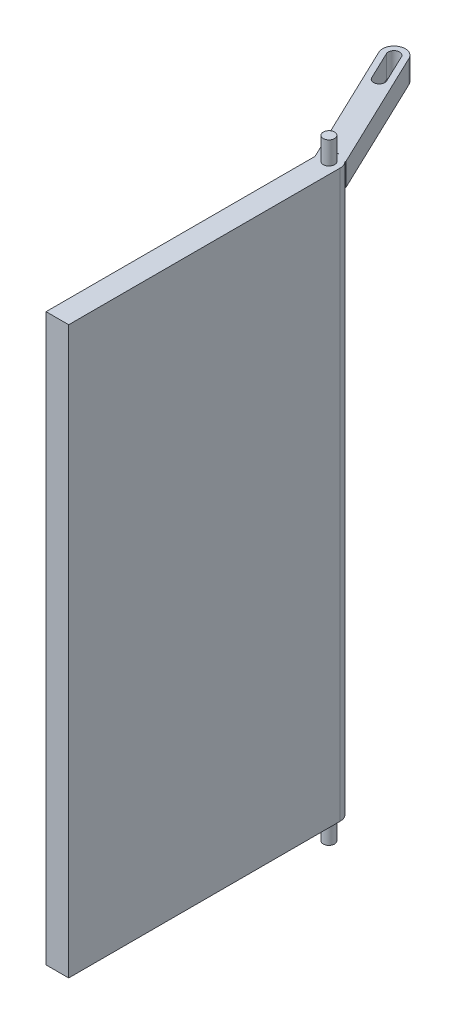
ISO-10303-21;
HEADER;
FILE_DESCRIPTION(('STEP AP214'),'2;1');
FILE_NAME('part.step','',(''),(''),'','','');
FILE_SCHEMA(('AUTOMOTIVE_DESIGN { 1 0 10303 214 1 1 1 1 }'));
ENDSEC;
DATA;
#1=APPLICATION_CONTEXT('core data for automotive mechanical design processes');
#2=APPLICATION_PROTOCOL_DEFINITION('international standard','automotive_design',2000,#1);
#3=PRODUCT_CONTEXT('',#1,'mechanical');
#4=PRODUCT('Part','Part','',(#3));
#5=PRODUCT_RELATED_PRODUCT_CATEGORY('part','',(#4));
#6=PRODUCT_DEFINITION_FORMATION('','',#4);
#7=PRODUCT_DEFINITION_CONTEXT('part definition',#1,'design');
#8=PRODUCT_DEFINITION('design','',#6,#7);
#9=PRODUCT_DEFINITION_SHAPE('','',#8);
#10=(LENGTH_UNIT() NAMED_UNIT(*) SI_UNIT(.MILLI.,.METRE.));
#11=(NAMED_UNIT(*) PLANE_ANGLE_UNIT() SI_UNIT($,.RADIAN.));
#12=(NAMED_UNIT(*) SI_UNIT($,.STERADIAN.) SOLID_ANGLE_UNIT());
#13=UNCERTAINTY_MEASURE_WITH_UNIT(LENGTH_MEASURE(1.E-05),#10,'distance_accuracy_value','');
#14=(GEOMETRIC_REPRESENTATION_CONTEXT(3) GLOBAL_UNCERTAINTY_ASSIGNED_CONTEXT((#13)) GLOBAL_UNIT_ASSIGNED_CONTEXT((#10,
#11,#12)) REPRESENTATION_CONTEXT('',''));
#15=CARTESIAN_POINT('',(0.,0.,0.));
#16=DIRECTION('',(0.,0.,1.));
#17=DIRECTION('',(1.,0.,0.));
#18=AXIS2_PLACEMENT_3D('',#15,#16,#17);
#19=CARTESIAN_POINT('',(190.,-423.051186344326,0.));
#20=DIRECTION('',(-1.,0.,0.));
#21=DIRECTION('',(0.,0.,1.));
#22=AXIS2_PLACEMENT_3D('',#19,#20,#21);
#23=PLANE('',#22);
#24=DIRECTION('',(0.,0.,1.));
#25=VECTOR('',#24,1.);
#26=CARTESIAN_POINT('',(190.,-122.731696712451,0.));
#27=LINE('',#26,#25);
#28=CARTESIAN_POINT('',(190.,-122.731696712451,59.9062300544291));
#29=VERTEX_POINT('',#28);
#30=CARTESIAN_POINT('',(190.,-122.731696712451,155.));
#31=VERTEX_POINT('',#30);
#32=EDGE_CURVE('E261',#29,#31,#27,.T.);
#33=ORIENTED_EDGE('',*,*,#32,.F.);
#34=DIRECTION('',(0.,1.,0.));
#35=VECTOR('',#34,1.);
#36=CARTESIAN_POINT('',(190.,-130.731696712451,59.9062300544291));
#37=LINE('',#36,#35);
#38=CARTESIAN_POINT('',(190.,-130.731696712451,59.9062300544291));
#39=VERTEX_POINT('',#38);
#40=EDGE_CURVE('E242',#39,#29,#37,.T.);
#41=ORIENTED_EDGE('',*,*,#40,.F.);
#42=DIRECTION('',(0.,0.,1.));
#43=VECTOR('',#42,1.);
#44=CARTESIAN_POINT('',(190.,-130.731696712451,0.));
#45=LINE('',#44,#43);
#46=CARTESIAN_POINT('',(190.,-130.731696712451,59.));
#47=VERTEX_POINT('',#46);
#48=EDGE_CURVE('E208',#47,#39,#45,.T.);
#49=ORIENTED_EDGE('',*,*,#48,.F.);
#50=DIRECTION('',(0.,1.,0.));
#51=VECTOR('',#50,1.);
#52=CARTESIAN_POINT('',(190.,-423.051186344326,59.));
#53=LINE('',#52,#51);
#54=CARTESIAN_POINT('',(190.,-322.731696712451,59.));
#55=VERTEX_POINT('',#54);
#56=EDGE_CURVE('E271',#55,#47,#53,.T.);
#57=ORIENTED_EDGE('',*,*,#56,.F.);
#58=DIRECTION('',(0.,0.,-1.));
#59=VECTOR('',#58,1.);
#60=CARTESIAN_POINT('',(190.,-322.731696712451,0.));
#61=LINE('',#60,#59);
#62=CARTESIAN_POINT('',(190.,-322.731696712451,155.));
#63=VERTEX_POINT('',#62);
#64=EDGE_CURVE('E249',#63,#55,#61,.T.);
#65=ORIENTED_EDGE('',*,*,#64,.F.);
#66=DIRECTION('',(0.,1.,0.));
#67=VECTOR('',#66,1.);
#68=CARTESIAN_POINT('',(190.,-423.051186344326,155.));
#69=LINE('',#68,#67);
#70=EDGE_CURVE('E268',#63,#31,#69,.T.);
#71=ORIENTED_EDGE('',*,*,#70,.T.);
#72=EDGE_LOOP('',(#33,#41,#49,#57,#65,#71));
#73=FACE_BOUND('',#72,.T.);
#74=ADVANCED_FACE('F35',(#73),#23,.T.);
#75=CARTESIAN_POINT('',(198.,-423.051186344326,0.));
#76=DIRECTION('',(1.,0.,0.));
#77=DIRECTION('',(0.,0.,-1.));
#78=AXIS2_PLACEMENT_3D('',#75,#76,#77);
#79=PLANE('',#78);
#80=DIRECTION('',(0.,0.,1.));
#81=VECTOR('',#80,1.);
#82=CARTESIAN_POINT('',(198.,-322.731696712451,0.));
#83=LINE('',#82,#81);
#84=CARTESIAN_POINT('',(198.,-322.731696712451,59.));
#85=VERTEX_POINT('',#84);
#86=CARTESIAN_POINT('',(198.,-322.731696712451,155.));
#87=VERTEX_POINT('',#86);
#88=EDGE_CURVE('E43',#85,#87,#83,.T.);
#89=ORIENTED_EDGE('',*,*,#88,.F.);
#90=DIRECTION('',(0.,1.,0.));
#91=VECTOR('',#90,1.);
#92=CARTESIAN_POINT('',(198.,-423.051186344326,59.));
#93=LINE('',#92,#91);
#94=CARTESIAN_POINT('',(198.,-122.731696712451,59.));
#95=VERTEX_POINT('',#94);
#96=EDGE_CURVE('E266',#85,#95,#93,.T.);
#97=ORIENTED_EDGE('',*,*,#96,.T.);
#98=DIRECTION('',(0.,0.,-1.));
#99=VECTOR('',#98,1.);
#100=CARTESIAN_POINT('',(198.,-122.731696712451,0.));
#101=LINE('',#100,#99);
#102=CARTESIAN_POINT('',(198.,-122.731696712451,155.));
#103=VERTEX_POINT('',#102);
#104=EDGE_CURVE('E233',#103,#95,#101,.T.);
#105=ORIENTED_EDGE('',*,*,#104,.F.);
#106=DIRECTION('',(0.,1.,0.));
#107=VECTOR('',#106,1.);
#108=CARTESIAN_POINT('',(198.,-423.051186344326,155.));
#109=LINE('',#108,#107);
#110=EDGE_CURVE('E252',#87,#103,#109,.T.);
#111=ORIENTED_EDGE('',*,*,#110,.F.);
#112=EDGE_LOOP('',(#89,#97,#105,#111));
#113=FACE_BOUND('',#112,.T.);
#114=ADVANCED_FACE('F37',(#113),#79,.T.);
#115=CARTESIAN_POINT('',(190.,-423.051186344326,155.));
#116=DIRECTION('',(0.,0.,1.));
#117=DIRECTION('',(1.,0.,0.));
#118=AXIS2_PLACEMENT_3D('',#115,#116,#117);
#119=PLANE('',#118);
#120=DIRECTION('',(-1.,0.,0.));
#121=VECTOR('',#120,1.);
#122=CARTESIAN_POINT('',(190.,-322.731696712451,155.));
#123=LINE('',#122,#121);
#124=EDGE_CURVE('E251',#87,#63,#123,.T.);
#125=ORIENTED_EDGE('',*,*,#124,.F.);
#126=ORIENTED_EDGE('',*,*,#110,.T.);
#127=DIRECTION('',(1.,0.,0.));
#128=VECTOR('',#127,1.);
#129=CARTESIAN_POINT('',(190.,-122.731696712451,155.));
#130=LINE('',#129,#128);
#131=EDGE_CURVE('E263',#31,#103,#130,.T.);
#132=ORIENTED_EDGE('',*,*,#131,.F.);
#133=ORIENTED_EDGE('',*,*,#70,.F.);
#134=EDGE_LOOP('',(#125,#126,#132,#133));
#135=FACE_BOUND('',#134,.T.);
#136=ADVANCED_FACE('F290',(#135),#119,.T.);
#137=CARTESIAN_POINT('',(194.,-423.051186344326,59.));
#138=DIRECTION('',(0.,1.,0.));
#139=DIRECTION('',(0.,0.,1.));
#140=AXIS2_PLACEMENT_3D('',#137,#138,#139);
#141=CYLINDRICAL_SURFACE('',#140,4.00000000000002);
#142=DIRECTION('',(0.,1.,0.));
#143=VECTOR('',#142,1.);
#144=CARTESIAN_POINT('',(191.171572875254,-130.731696712451,56.1715728752538));
#145=LINE('',#144,#143);
#146=CARTESIAN_POINT('',(191.171572875254,-130.731696712451,56.1715728752538));
#147=VERTEX_POINT('',#146);
#148=CARTESIAN_POINT('',(191.171572875254,-122.731696712451,56.1715728752538));
#149=VERTEX_POINT('',#148);
#150=EDGE_CURVE('E239',#147,#149,#145,.T.);
#151=ORIENTED_EDGE('',*,*,#150,.T.);
#152=CARTESIAN_POINT('',(194.,-122.731696712451,59.));
#153=DIRECTION('',(0.,1.,0.));
#154=DIRECTION('',(0.,0.,1.));
#155=AXIS2_PLACEMENT_3D('',#152,#153,#154);
#156=CIRCLE('',#155,4.00000000000002);
#157=CARTESIAN_POINT('',(194.,-122.731696712451,55.));
#158=VERTEX_POINT('',#157);
#159=EDGE_CURVE('E257',#158,#149,#156,.T.);
#160=ORIENTED_EDGE('',*,*,#159,.F.);
#161=DIRECTION('',(0.,1.,0.));
#162=VECTOR('',#161,1.);
#163=CARTESIAN_POINT('',(194.,-130.731696712451,55.));
#164=LINE('',#163,#162);
#165=CARTESIAN_POINT('',(194.,-130.731696712451,55.));
#166=VERTEX_POINT('',#165);
#167=EDGE_CURVE('E234',#166,#158,#164,.T.);
#168=ORIENTED_EDGE('',*,*,#167,.F.);
#169=CARTESIAN_POINT('',(194.,-130.731696712451,59.));
#170=DIRECTION('',(0.,1.,0.));
#171=DIRECTION('',(0.,0.,1.));
#172=AXIS2_PLACEMENT_3D('',#169,#170,#171);
#173=CIRCLE('',#172,4.00000000000002);
#174=CARTESIAN_POINT('',(196.828427124746,-130.731696712451,56.1715728752538));
#175=VERTEX_POINT('',#174);
#176=EDGE_CURVE('E216',#175,#166,#173,.T.);
#177=ORIENTED_EDGE('',*,*,#176,.F.);
#178=DIRECTION('',(0.,1.,0.));
#179=VECTOR('',#178,1.);
#180=CARTESIAN_POINT('',(196.828427124746,-130.731696712451,56.1715728752538));
#181=LINE('',#180,#179);
#182=CARTESIAN_POINT('',(196.828427124746,-122.731696712451,56.1715728752538));
#183=VERTEX_POINT('',#182);
#184=EDGE_CURVE('E230',#175,#183,#181,.T.);
#185=ORIENTED_EDGE('',*,*,#184,.T.);
#186=EDGE_CURVE('E258',#95,#183,#156,.T.);
#187=ORIENTED_EDGE('',*,*,#186,.F.);
#188=ORIENTED_EDGE('',*,*,#96,.F.);
#189=CARTESIAN_POINT('',(194.,-322.731696712451,59.));
#190=DIRECTION('',(0.,1.,0.));
#191=DIRECTION('',(0.,0.,1.));
#192=AXIS2_PLACEMENT_3D('',#189,#190,#191);
#193=CIRCLE('',#192,4.00000000000002);
#194=EDGE_CURVE('E11',#55,#85,#193,.F.);
#195=ORIENTED_EDGE('',*,*,#194,.F.);
#196=ORIENTED_EDGE('',*,*,#56,.T.);
#197=CARTESIAN_POINT('',(194.,-130.731696712451,59.));
#198=DIRECTION('',(0.,1.,0.));
#199=DIRECTION('',(0.,0.,1.));
#200=AXIS2_PLACEMENT_3D('',#197,#198,#199);
#201=CIRCLE('',#200,4.00000000000002);
#202=EDGE_CURVE('E210',#147,#47,#201,.T.);
#203=ORIENTED_EDGE('',*,*,#202,.F.);
#204=EDGE_LOOP('',(#151,#160,#168,#177,#185,#187,#188,#195,#196,#203));
#205=FACE_BOUND('',#204,.T.);
#206=ADVANCED_FACE('F281',(#205),#141,.T.);
#207=CARTESIAN_POINT('',(194.,-122.731696712451,59.));
#208=DIRECTION('',(0.,1.,0.));
#209=DIRECTION('',(0.,0.,1.));
#210=AXIS2_PLACEMENT_3D('',#207,#208,#209);
#211=PLANE('',#210);
#212=CARTESIAN_POINT('',(194.,-122.731696712451,59.));
#213=DIRECTION('',(0.,1.,0.));
#214=DIRECTION('',(0.,0.,1.));
#215=AXIS2_PLACEMENT_3D('',#212,#213,#214);
#216=CIRCLE('',#215,2.);
#217=CARTESIAN_POINT('',(194.,-122.731696712451,61.));
#218=VERTEX_POINT('',#217);
#219=EDGE_CURVE('E180',#218,#218,#216,.T.);
#220=ORIENTED_EDGE('',*,*,#219,.F.);
#221=EDGE_LOOP('',(#220));
#222=FACE_BOUND('',#221,.T.);
#223=DIRECTION('',(-1.,0.,0.));
#224=VECTOR('',#223,1.);
#225=CARTESIAN_POINT('',(190.,-122.731696712451,55.));
#226=LINE('',#225,#224);
#227=CARTESIAN_POINT('',(192.343145750507,-122.731696712451,55.));
#228=VERTEX_POINT('',#227);
#229=EDGE_CURVE('E58',#158,#228,#226,.T.);
#230=ORIENTED_EDGE('',*,*,#229,.F.);
#231=ORIENTED_EDGE('',*,*,#159,.T.);
#232=DIRECTION('',(-0.707106781186544,0.,0.707106781186551));
#233=VECTOR('',#232,1.);
#234=CARTESIAN_POINT('',(218.671572875254,-122.731696712451,28.6715728752535));
#235=LINE('',#234,#233);
#236=EDGE_CURVE('E227',#228,#149,#235,.T.);
#237=ORIENTED_EDGE('',*,*,#236,.F.);
#238=EDGE_LOOP('',(#230,#231,#237));
#239=FACE_BOUND('',#238,.T.);
#240=ORIENTED_EDGE('',*,*,#104,.T.);
#241=ORIENTED_EDGE('',*,*,#186,.T.);
#242=DIRECTION('',(0.707106781186544,0.,-0.707106781186551));
#243=VECTOR('',#242,1.);
#244=CARTESIAN_POINT('',(221.5,-122.731696712451,31.4999999999997));
#245=LINE('',#244,#243);
#246=CARTESIAN_POINT('',(196.999966519272,-122.731696712451,56.0000334807283));
#247=VERTEX_POINT('',#246);
#248=EDGE_CURVE('E193',#183,#247,#245,.T.);
#249=ORIENTED_EDGE('',*,*,#248,.T.);
#250=DIRECTION('',(-0.430992891763407,0.,-0.902355322059673));
#251=VECTOR('',#250,1.);
#252=CARTESIAN_POINT('',(173.920786747733,-122.731696712451,7.67993100662043));
#253=LINE('',#252,#251);
#254=CARTESIAN_POINT('',(176.593656462577,-122.731696712451,13.2760284329464));
#255=VERTEX_POINT('',#254);
#256=EDGE_CURVE('E221',#247,#255,#253,.T.);
#257=ORIENTED_EDGE('',*,*,#256,.T.);
#258=CARTESIAN_POINT('',(172.984235174339,-122.731696712451,15.));
#259=DIRECTION('',(0.,1.,0.));
#260=DIRECTION('',(0.,0.,1.));
#261=AXIS2_PLACEMENT_3D('',#258,#259,#260);
#262=CIRCLE('',#261,3.99999999999999);
#263=CARTESIAN_POINT('',(169.3748138861,-122.731696712451,16.7239715670536));
#264=VERTEX_POINT('',#263);
#265=EDGE_CURVE('E224',#255,#264,#262,.T.);
#266=ORIENTED_EDGE('',*,*,#265,.T.);
#267=DIRECTION('',(-0.430992891763407,0.,-0.902355322059673));
#268=VECTOR('',#267,1.);
#269=CARTESIAN_POINT('',(166.701944171256,-122.731696712451,11.1278741407277));
#270=LINE('',#269,#268);
#271=EDGE_CURVE('E50',#29,#264,#270,.T.);
#272=ORIENTED_EDGE('',*,*,#271,.F.);
#273=ORIENTED_EDGE('',*,*,#32,.T.);
#274=ORIENTED_EDGE('',*,*,#131,.T.);
#275=EDGE_LOOP('',(#240,#241,#249,#257,#266,#272,#273,#274));
#276=FACE_BOUND('',#275,.T.);
#277=CARTESIAN_POINT('',(172.984235174339,-122.731696712451,15.));
#278=DIRECTION('',(0.,1.,0.));
#279=DIRECTION('',(0.,0.,1.));
#280=AXIS2_PLACEMENT_3D('',#277,#278,#279);
#281=CIRCLE('',#280,2.00000000000001);
#282=CARTESIAN_POINT('',(174.788945818458,-122.731696712451,14.1380142164732));
#283=VERTEX_POINT('',#282);
#284=CARTESIAN_POINT('',(171.179524530219,-122.731696712451,15.8619857835268));
#285=VERTEX_POINT('',#284);
#286=EDGE_CURVE('E168',#283,#285,#281,.T.);
#287=ORIENTED_EDGE('',*,*,#286,.F.);
#288=DIRECTION('',(-0.430992891763407,0.,-0.902355322059673));
#289=VECTOR('',#288,1.);
#290=CARTESIAN_POINT('',(172.116076103614,-122.731696712451,8.54191679014724));
#291=LINE('',#290,#289);
#292=CARTESIAN_POINT('',(179.552402091958,-122.731696712451,24.1111024087279));
#293=VERTEX_POINT('',#292);
#294=EDGE_CURVE('E174',#293,#283,#291,.T.);
#295=ORIENTED_EDGE('',*,*,#294,.F.);
#296=CARTESIAN_POINT('',(177.747691447839,-122.731696712451,24.9730881922548));
#297=DIRECTION('',(0.,1.,0.));
#298=DIRECTION('',(0.,0.,1.));
#299=AXIS2_PLACEMENT_3D('',#296,#297,#298);
#300=CIRCLE('',#299,2.00000000000001);
#301=CARTESIAN_POINT('',(175.942980803719,-122.731696712451,25.8350739757817));
#302=VERTEX_POINT('',#301);
#303=EDGE_CURVE('E177',#302,#293,#300,.T.);
#304=ORIENTED_EDGE('',*,*,#303,.F.);
#305=DIRECTION('',(-0.430992891763407,0.,-0.902355322059673));
#306=VECTOR('',#305,1.);
#307=CARTESIAN_POINT('',(168.506654815375,-122.731696712451,10.2658883572009));
#308=LINE('',#307,#306);
#309=EDGE_CURVE('E186',#302,#285,#308,.T.);
#310=ORIENTED_EDGE('',*,*,#309,.T.);
#311=EDGE_LOOP('',(#287,#295,#304,#310));
#312=FACE_BOUND('',#311,.T.);
#313=ADVANCED_FACE('F283',(#222,#239,#276,#312),#211,.T.);
#314=CARTESIAN_POINT('',(190.,-322.731696712451,0.));
#315=DIRECTION('',(0.,1.,0.));
#316=DIRECTION('',(0.,0.,1.));
#317=AXIS2_PLACEMENT_3D('',#314,#315,#316);
#318=PLANE('',#317);
#319=CARTESIAN_POINT('',(194.,-322.731696712451,59.));
#320=DIRECTION('',(0.,1.,0.));
#321=DIRECTION('',(0.,0.,1.));
#322=AXIS2_PLACEMENT_3D('',#319,#320,#321);
#323=CIRCLE('',#322,2.);
#324=CARTESIAN_POINT('',(194.,-322.731696712451,61.));
#325=VERTEX_POINT('',#324);
#326=EDGE_CURVE('E502',#325,#325,#323,.T.);
#327=ORIENTED_EDGE('',*,*,#326,.T.);
#328=EDGE_LOOP('',(#327));
#329=FACE_BOUND('',#328,.T.);
#330=ORIENTED_EDGE('',*,*,#88,.T.);
#331=ORIENTED_EDGE('',*,*,#124,.T.);
#332=ORIENTED_EDGE('',*,*,#64,.T.);
#333=ORIENTED_EDGE('',*,*,#194,.T.);
#334=EDGE_LOOP('',(#330,#331,#332,#333));
#335=FACE_BOUND('',#334,.T.);
#336=ADVANCED_FACE('F293',(#329,#335),#318,.F.);
#337=CARTESIAN_POINT('',(221.5,-130.731696712451,31.4999999999997));
#338=DIRECTION('',(0.707106781186552,0.,0.707106781186544));
#339=DIRECTION('',(0.707106781186544,0.,-0.707106781186551));
#340=AXIS2_PLACEMENT_3D('',#337,#338,#339);
#341=PLANE('',#340);
#342=ORIENTED_EDGE('',*,*,#248,.F.);
#343=ORIENTED_EDGE('',*,*,#184,.F.);
#344=DIRECTION('',(0.707106781186544,0.,-0.707106781186551));
#345=VECTOR('',#344,1.);
#346=CARTESIAN_POINT('',(221.5,-130.731696712451,31.4999999999997));
#347=LINE('',#346,#345);
#348=CARTESIAN_POINT('',(196.999966519272,-130.731696712451,56.0000334807283));
#349=VERTEX_POINT('',#348);
#350=EDGE_CURVE('E197',#175,#349,#347,.T.);
#351=ORIENTED_EDGE('',*,*,#350,.T.);
#352=DIRECTION('',(0.,1.,0.));
#353=VECTOR('',#352,1.);
#354=CARTESIAN_POINT('',(196.999966519272,-130.731696712451,56.0000334807283));
#355=LINE('',#354,#353);
#356=EDGE_CURVE('E218',#349,#247,#355,.T.);
#357=ORIENTED_EDGE('',*,*,#356,.T.);
#358=EDGE_LOOP('',(#342,#343,#351,#357));
#359=FACE_BOUND('',#358,.T.);
#360=ADVANCED_FACE('F312',(#359),#341,.T.);
#361=CARTESIAN_POINT('',(190.,-130.731696712451,55.));
#362=DIRECTION('',(0.,0.,-1.));
#363=DIRECTION('',(-1.,0.,0.));
#364=AXIS2_PLACEMENT_3D('',#361,#362,#363);
#365=PLANE('',#364);
#366=ORIENTED_EDGE('',*,*,#229,.T.);
#367=DIRECTION('',(0.,1.,0.));
#368=VECTOR('',#367,1.);
#369=CARTESIAN_POINT('',(192.343145750507,-130.731696712451,55.));
#370=LINE('',#369,#368);
#371=CARTESIAN_POINT('',(192.343145750507,-130.731696712451,55.));
#372=VERTEX_POINT('',#371);
#373=EDGE_CURVE('E236',#372,#228,#370,.T.);
#374=ORIENTED_EDGE('',*,*,#373,.F.);
#375=DIRECTION('',(-1.,0.,0.));
#376=VECTOR('',#375,1.);
#377=CARTESIAN_POINT('',(190.,-130.731696712451,55.));
#378=LINE('',#377,#376);
#379=EDGE_CURVE('E214',#166,#372,#378,.T.);
#380=ORIENTED_EDGE('',*,*,#379,.F.);
#381=ORIENTED_EDGE('',*,*,#167,.T.);
#382=EDGE_LOOP('',(#366,#374,#380,#381));
#383=FACE_BOUND('',#382,.T.);
#384=ADVANCED_FACE('F310',(#383),#365,.F.);
#385=CARTESIAN_POINT('',(218.671572875254,-130.731696712451,28.6715728752535));
#386=DIRECTION('',(-0.707106781186552,0.,-0.707106781186544));
#387=DIRECTION('',(-0.707106781186544,0.,0.707106781186551));
#388=AXIS2_PLACEMENT_3D('',#385,#386,#387);
#389=PLANE('',#388);
#390=ORIENTED_EDGE('',*,*,#236,.T.);
#391=ORIENTED_EDGE('',*,*,#150,.F.);
#392=DIRECTION('',(-0.707106781186544,0.,0.707106781186551));
#393=VECTOR('',#392,1.);
#394=CARTESIAN_POINT('',(218.671572875254,-130.731696712451,28.6715728752535));
#395=LINE('',#394,#393);
#396=EDGE_CURVE('E212',#372,#147,#395,.T.);
#397=ORIENTED_EDGE('',*,*,#396,.F.);
#398=ORIENTED_EDGE('',*,*,#373,.T.);
#399=EDGE_LOOP('',(#390,#391,#397,#398));
#400=FACE_BOUND('',#399,.T.);
#401=ADVANCED_FACE('F307',(#400),#389,.F.);
#402=CARTESIAN_POINT('',(166.701944171256,-130.731696712451,11.1278741407277));
#403=DIRECTION('',(0.902355322059673,0.,-0.430992891763407));
#404=DIRECTION('',(-0.430992891763407,0.,-0.902355322059673));
#405=AXIS2_PLACEMENT_3D('',#402,#403,#404);
#406=PLANE('',#405);
#407=ORIENTED_EDGE('',*,*,#271,.T.);
#408=DIRECTION('',(0.,1.,0.));
#409=VECTOR('',#408,1.);
#410=CARTESIAN_POINT('',(169.3748138861,-130.731696712451,16.7239715670536));
#411=LINE('',#410,#409);
#412=CARTESIAN_POINT('',(169.3748138861,-130.731696712451,16.7239715670536));
#413=VERTEX_POINT('',#412);
#414=EDGE_CURVE('E244',#413,#264,#411,.T.);
#415=ORIENTED_EDGE('',*,*,#414,.F.);
#416=DIRECTION('',(-0.430992891763407,0.,-0.902355322059673));
#417=VECTOR('',#416,1.);
#418=CARTESIAN_POINT('',(166.701944171256,-130.731696712451,11.1278741407277));
#419=LINE('',#418,#417);
#420=EDGE_CURVE('E206',#39,#413,#419,.T.);
#421=ORIENTED_EDGE('',*,*,#420,.F.);
#422=ORIENTED_EDGE('',*,*,#40,.T.);
#423=EDGE_LOOP('',(#407,#415,#421,#422));
#424=FACE_BOUND('',#423,.T.);
#425=ADVANCED_FACE('F318',(#424),#406,.F.);
#426=CARTESIAN_POINT('',(172.984235174339,-130.731696712451,15.));
#427=DIRECTION('',(0.,1.,0.));
#428=DIRECTION('',(0.,0.,1.));
#429=AXIS2_PLACEMENT_3D('',#426,#427,#428);
#430=CYLINDRICAL_SURFACE('',#429,3.99999999999999);
#431=ORIENTED_EDGE('',*,*,#265,.F.);
#432=DIRECTION('',(0.,1.,0.));
#433=VECTOR('',#432,1.);
#434=CARTESIAN_POINT('',(176.593656462577,-130.731696712451,13.2760284329464));
#435=LINE('',#434,#433);
#436=CARTESIAN_POINT('',(176.593656462577,-130.731696712451,13.2760284329464));
#437=VERTEX_POINT('',#436);
#438=EDGE_CURVE('E246',#437,#255,#435,.T.);
#439=ORIENTED_EDGE('',*,*,#438,.F.);
#440=CARTESIAN_POINT('',(172.984235174339,-130.731696712451,15.));
#441=DIRECTION('',(0.,1.,0.));
#442=DIRECTION('',(0.,0.,1.));
#443=AXIS2_PLACEMENT_3D('',#440,#441,#442);
#444=CIRCLE('',#443,3.99999999999999);
#445=EDGE_CURVE('E203',#437,#413,#444,.T.);
#446=ORIENTED_EDGE('',*,*,#445,.T.);
#447=ORIENTED_EDGE('',*,*,#414,.T.);
#448=EDGE_LOOP('',(#431,#439,#446,#447));
#449=FACE_BOUND('',#448,.T.);
#450=ADVANCED_FACE('F374',(#449),#430,.T.);
#451=CARTESIAN_POINT('',(173.920786747733,-130.731696712451,7.67993100662043));
#452=DIRECTION('',(0.902355322059673,0.,-0.430992891763407));
#453=DIRECTION('',(-0.430992891763407,0.,-0.902355322059673));
#454=AXIS2_PLACEMENT_3D('',#451,#452,#453);
#455=PLANE('',#454);
#456=ORIENTED_EDGE('',*,*,#256,.F.);
#457=ORIENTED_EDGE('',*,*,#356,.F.);
#458=DIRECTION('',(-0.430992891763407,0.,-0.902355322059673));
#459=VECTOR('',#458,1.);
#460=CARTESIAN_POINT('',(173.920786747733,-130.731696712451,7.67993100662043));
#461=LINE('',#460,#459);
#462=EDGE_CURVE('E200',#349,#437,#461,.T.);
#463=ORIENTED_EDGE('',*,*,#462,.T.);
#464=ORIENTED_EDGE('',*,*,#438,.T.);
#465=EDGE_LOOP('',(#456,#457,#463,#464));
#466=FACE_BOUND('',#465,.T.);
#467=ADVANCED_FACE('F384',(#466),#455,.T.);
#468=CARTESIAN_POINT('',(172.984235174339,-130.731696712451,15.));
#469=DIRECTION('',(0.,1.,0.));
#470=DIRECTION('',(0.,0.,1.));
#471=AXIS2_PLACEMENT_3D('',#468,#469,#470);
#472=PLANE('',#471);
#473=DIRECTION('',(-0.430992891763407,0.,-0.902355322059673));
#474=VECTOR('',#473,1.);
#475=CARTESIAN_POINT('',(172.116076103614,-130.731696712451,8.54191679014724));
#476=LINE('',#475,#474);
#477=CARTESIAN_POINT('',(179.552402091958,-130.731696712451,24.1111024087279));
#478=VERTEX_POINT('',#477);
#479=CARTESIAN_POINT('',(174.788945818458,-130.731696712451,14.1380142164732));
#480=VERTEX_POINT('',#479);
#481=EDGE_CURVE('E169',#478,#480,#476,.T.);
#482=ORIENTED_EDGE('',*,*,#481,.T.);
#483=CARTESIAN_POINT('',(172.984235174339,-130.731696712451,15.));
#484=DIRECTION('',(0.,1.,0.));
#485=DIRECTION('',(0.,0.,1.));
#486=AXIS2_PLACEMENT_3D('',#483,#484,#485);
#487=CIRCLE('',#486,2.00000000000001);
#488=CARTESIAN_POINT('',(171.179524530219,-130.731696712451,15.8619857835268));
#489=VERTEX_POINT('',#488);
#490=EDGE_CURVE('E161',#480,#489,#487,.T.);
#491=ORIENTED_EDGE('',*,*,#490,.T.);
#492=DIRECTION('',(-0.430992891763407,0.,-0.902355322059673));
#493=VECTOR('',#492,1.);
#494=CARTESIAN_POINT('',(168.506654815375,-130.731696712451,10.2658883572009));
#495=LINE('',#494,#493);
#496=CARTESIAN_POINT('',(175.94298080372,-130.731696712451,25.8350739757817));
#497=VERTEX_POINT('',#496);
#498=EDGE_CURVE('E150',#497,#489,#495,.T.);
#499=ORIENTED_EDGE('',*,*,#498,.F.);
#500=CARTESIAN_POINT('',(177.747691447839,-130.731696712451,24.9730881922548));
#501=DIRECTION('',(0.,1.,0.));
#502=DIRECTION('',(0.,0.,1.));
#503=AXIS2_PLACEMENT_3D('',#500,#501,#502);
#504=CIRCLE('',#503,2.00000000000001);
#505=EDGE_CURVE('E160',#497,#478,#504,.T.);
#506=ORIENTED_EDGE('',*,*,#505,.T.);
#507=EDGE_LOOP('',(#482,#491,#499,#506));
#508=FACE_BOUND('',#507,.T.);
#509=ORIENTED_EDGE('',*,*,#350,.F.);
#510=ORIENTED_EDGE('',*,*,#176,.T.);
#511=ORIENTED_EDGE('',*,*,#379,.T.);
#512=ORIENTED_EDGE('',*,*,#396,.T.);
#513=ORIENTED_EDGE('',*,*,#202,.T.);
#514=ORIENTED_EDGE('',*,*,#48,.T.);
#515=ORIENTED_EDGE('',*,*,#420,.T.);
#516=ORIENTED_EDGE('',*,*,#445,.F.);
#517=ORIENTED_EDGE('',*,*,#462,.F.);
#518=EDGE_LOOP('',(#509,#510,#511,#512,#513,#514,#515,#516,#517));
#519=FACE_BOUND('',#518,.T.);
#520=ADVANCED_FACE('F171',(#508,#519),#472,.F.);
#521=CARTESIAN_POINT('',(172.984235174339,-130.731696712451,15.));
#522=DIRECTION('',(0.,1.,0.));
#523=DIRECTION('',(0.,0.,1.));
#524=AXIS2_PLACEMENT_3D('',#521,#522,#523);
#525=CYLINDRICAL_SURFACE('',#524,2.00000000000001);
#526=ORIENTED_EDGE('',*,*,#286,.T.);
#527=DIRECTION('',(0.,1.,0.));
#528=VECTOR('',#527,1.);
#529=CARTESIAN_POINT('',(171.179524530219,-130.731696712451,15.8619857835268));
#530=LINE('',#529,#528);
#531=EDGE_CURVE('E154',#489,#285,#530,.T.);
#532=ORIENTED_EDGE('',*,*,#531,.F.);
#533=ORIENTED_EDGE('',*,*,#490,.F.);
#534=DIRECTION('',(0.,1.,0.));
#535=VECTOR('',#534,1.);
#536=CARTESIAN_POINT('',(174.788945818458,-130.731696712451,14.1380142164732));
#537=LINE('',#536,#535);
#538=EDGE_CURVE('E191',#480,#283,#537,.T.);
#539=ORIENTED_EDGE('',*,*,#538,.T.);
#540=EDGE_LOOP('',(#526,#532,#533,#539));
#541=FACE_BOUND('',#540,.T.);
#542=ADVANCED_FACE('F165',(#541),#525,.F.);
#543=CARTESIAN_POINT('',(172.116076103614,-130.731696712451,8.54191679014724));
#544=DIRECTION('',(0.902355322059673,0.,-0.430992891763407));
#545=DIRECTION('',(-0.430992891763407,0.,-0.902355322059673));
#546=AXIS2_PLACEMENT_3D('',#543,#544,#545);
#547=PLANE('',#546);
#548=ORIENTED_EDGE('',*,*,#294,.T.);
#549=ORIENTED_EDGE('',*,*,#538,.F.);
#550=ORIENTED_EDGE('',*,*,#481,.F.);
#551=DIRECTION('',(0.,1.,0.));
#552=VECTOR('',#551,1.);
#553=CARTESIAN_POINT('',(179.552402091958,-130.731696712451,24.1111024087279));
#554=LINE('',#553,#552);
#555=EDGE_CURVE('E194',#478,#293,#554,.T.);
#556=ORIENTED_EDGE('',*,*,#555,.T.);
#557=EDGE_LOOP('',(#548,#549,#550,#556));
#558=FACE_BOUND('',#557,.T.);
#559=ADVANCED_FACE('F428',(#558),#547,.F.);
#560=CARTESIAN_POINT('',(177.747691447839,-130.731696712451,24.9730881922548));
#561=DIRECTION('',(0.,1.,0.));
#562=DIRECTION('',(0.,0.,1.));
#563=AXIS2_PLACEMENT_3D('',#560,#561,#562);
#564=CYLINDRICAL_SURFACE('',#563,2.00000000000001);
#565=ORIENTED_EDGE('',*,*,#303,.T.);
#566=ORIENTED_EDGE('',*,*,#555,.F.);
#567=ORIENTED_EDGE('',*,*,#505,.F.);
#568=DIRECTION('',(0.,1.,0.));
#569=VECTOR('',#568,1.);
#570=CARTESIAN_POINT('',(175.942980803719,-130.731696712451,25.8350739757817));
#571=LINE('',#570,#569);
#572=EDGE_CURVE('E156',#497,#302,#571,.T.);
#573=ORIENTED_EDGE('',*,*,#572,.T.);
#574=EDGE_LOOP('',(#565,#566,#567,#573));
#575=FACE_BOUND('',#574,.T.);
#576=ADVANCED_FACE('F438',(#575),#564,.F.);
#577=CARTESIAN_POINT('',(168.506654815375,-130.731696712451,10.2658883572009));
#578=DIRECTION('',(0.902355322059673,0.,-0.430992891763407));
#579=DIRECTION('',(-0.430992891763407,0.,-0.902355322059673));
#580=AXIS2_PLACEMENT_3D('',#577,#578,#579);
#581=PLANE('',#580);
#582=ORIENTED_EDGE('',*,*,#309,.F.);
#583=ORIENTED_EDGE('',*,*,#572,.F.);
#584=ORIENTED_EDGE('',*,*,#498,.T.);
#585=ORIENTED_EDGE('',*,*,#531,.T.);
#586=EDGE_LOOP('',(#582,#583,#584,#585));
#587=FACE_BOUND('',#586,.T.);
#588=ADVANCED_FACE('F153',(#587),#581,.T.);
#589=CARTESIAN_POINT('',(194.,-114.731696712451,59.));
#590=DIRECTION('',(0.,-1.,0.));
#591=DIRECTION('',(0.,0.,-1.));
#592=AXIS2_PLACEMENT_3D('',#589,#590,#591);
#593=CYLINDRICAL_SURFACE('',#592,2.);
#594=CARTESIAN_POINT('',(194.,-114.731696712451,59.));
#595=DIRECTION('',(0.,1.,0.));
#596=DIRECTION('',(0.,0.,1.));
#597=AXIS2_PLACEMENT_3D('',#594,#595,#596);
#598=CIRCLE('',#597,2.);
#599=CARTESIAN_POINT('',(194.,-114.731696712451,61.));
#600=VERTEX_POINT('',#599);
#601=EDGE_CURVE('E187',#600,#600,#598,.T.);
#602=ORIENTED_EDGE('',*,*,#601,.F.);
#603=EDGE_LOOP('',(#602));
#604=FACE_BOUND('',#603,.T.);
#605=ORIENTED_EDGE('',*,*,#219,.T.);
#606=EDGE_LOOP('',(#605));
#607=FACE_BOUND('',#606,.T.);
#608=ADVANCED_FACE('F457',(#604,#607),#593,.T.);
#609=CARTESIAN_POINT('',(194.,-114.731696712451,59.));
#610=DIRECTION('',(0.,1.,0.));
#611=DIRECTION('',(0.,0.,1.));
#612=AXIS2_PLACEMENT_3D('',#609,#610,#611);
#613=PLANE('',#612);
#614=ORIENTED_EDGE('',*,*,#601,.T.);
#615=EDGE_LOOP('',(#614));
#616=FACE_BOUND('',#615,.T.);
#617=ADVANCED_FACE('F465',(#616),#613,.T.);
#618=CARTESIAN_POINT('',(194.,-330.731696712451,59.));
#619=DIRECTION('',(0.,1.,0.));
#620=DIRECTION('',(0.,0.,1.));
#621=AXIS2_PLACEMENT_3D('',#618,#619,#620);
#622=CYLINDRICAL_SURFACE('',#621,2.);
#623=CARTESIAN_POINT('',(194.,-330.731696712451,59.));
#624=DIRECTION('',(0.,1.,0.));
#625=DIRECTION('',(0.,0.,1.));
#626=AXIS2_PLACEMENT_3D('',#623,#624,#625);
#627=CIRCLE('',#626,2.);
#628=CARTESIAN_POINT('',(194.,-330.731696712451,61.));
#629=VERTEX_POINT('',#628);
#630=EDGE_CURVE('E501',#629,#629,#627,.T.);
#631=ORIENTED_EDGE('',*,*,#630,.T.);
#632=EDGE_LOOP('',(#631));
#633=FACE_BOUND('',#632,.T.);
#634=ORIENTED_EDGE('',*,*,#326,.F.);
#635=EDGE_LOOP('',(#634));
#636=FACE_BOUND('',#635,.T.);
#637=ADVANCED_FACE('F475',(#633,#636),#622,.T.);
#638=CARTESIAN_POINT('',(194.,-330.731696712451,59.));
#639=DIRECTION('',(0.,1.,0.));
#640=DIRECTION('',(0.,0.,1.));
#641=AXIS2_PLACEMENT_3D('',#638,#639,#640);
#642=PLANE('',#641);
#643=ORIENTED_EDGE('',*,*,#630,.F.);
#644=EDGE_LOOP('',(#643));
#645=FACE_BOUND('',#644,.T.);
#646=ADVANCED_FACE('F486',(#645),#642,.F.);
#647=CLOSED_SHELL('',(#74,#114,#136,#206,#313,#336,#360,#384,#401,#425,#450,#467,#520,#542,#559,
#576,#588,#608,#617,#637,#646));
#648=MANIFOLD_SOLID_BREP('B2',#647);
#649=ADVANCED_BREP_SHAPE_REPRESENTATION('',(#18,#648),#14);
#650=SHAPE_DEFINITION_REPRESENTATION(#9,#649);
ENDSEC;
END-ISO-10303-21;
